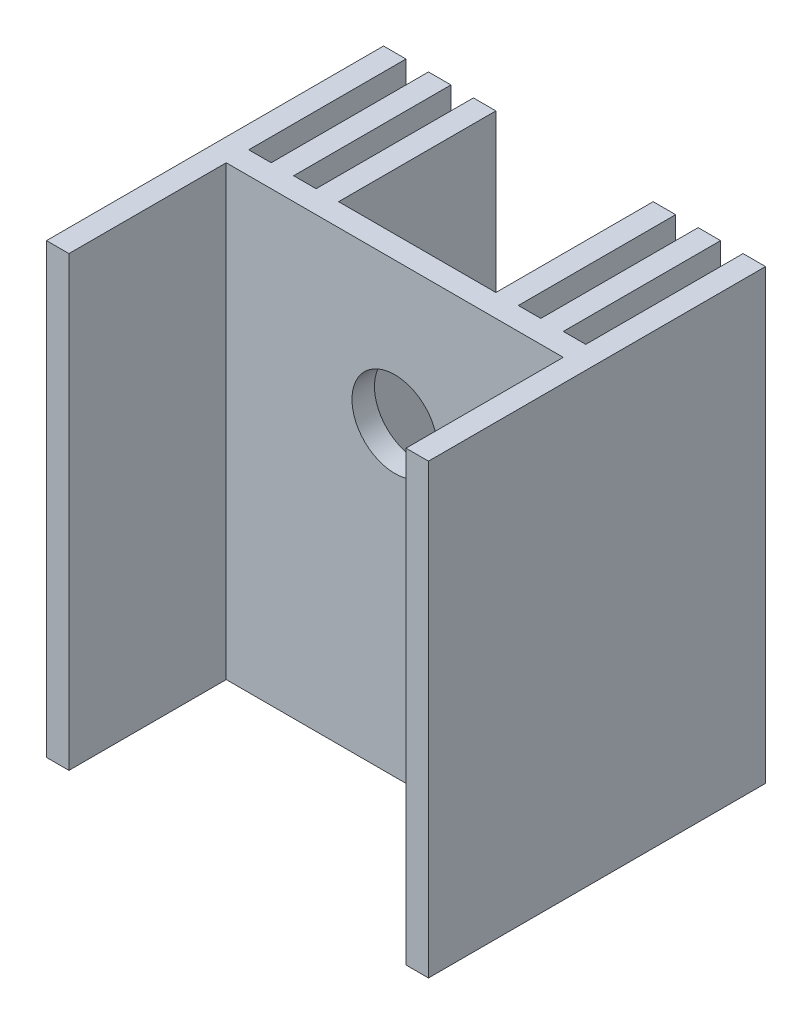
ISO-10303-21;
HEADER;
FILE_DESCRIPTION(('STEP AP214'),'2;1');
FILE_NAME('part.step','',(''),(''),'','','');
FILE_SCHEMA(('AUTOMOTIVE_DESIGN { 1 0 10303 214 1 1 1 1 }'));
ENDSEC;
DATA;
#1=APPLICATION_CONTEXT('core data for automotive mechanical design processes');
#2=APPLICATION_PROTOCOL_DEFINITION('international standard','automotive_design',2000,#1);
#3=PRODUCT_CONTEXT('',#1,'mechanical');
#4=PRODUCT('Part','Part','',(#3));
#5=PRODUCT_RELATED_PRODUCT_CATEGORY('part','',(#4));
#6=PRODUCT_DEFINITION_FORMATION('','',#4);
#7=PRODUCT_DEFINITION_CONTEXT('part definition',#1,'design');
#8=PRODUCT_DEFINITION('design','',#6,#7);
#9=PRODUCT_DEFINITION_SHAPE('','',#8);
#10=(LENGTH_UNIT() NAMED_UNIT(*) SI_UNIT(.MILLI.,.METRE.));
#11=(NAMED_UNIT(*) PLANE_ANGLE_UNIT() SI_UNIT($,.RADIAN.));
#12=(NAMED_UNIT(*) SI_UNIT($,.STERADIAN.) SOLID_ANGLE_UNIT());
#13=UNCERTAINTY_MEASURE_WITH_UNIT(LENGTH_MEASURE(1.E-05),#10,'distance_accuracy_value','');
#14=(GEOMETRIC_REPRESENTATION_CONTEXT(3) GLOBAL_UNCERTAINTY_ASSIGNED_CONTEXT((#13)) GLOBAL_UNIT_ASSIGNED_CONTEXT((#10,
#11,#12)) REPRESENTATION_CONTEXT('',''));
#15=CARTESIAN_POINT('',(0.,0.,0.));
#16=DIRECTION('',(0.,0.,1.));
#17=DIRECTION('',(1.,0.,0.));
#18=AXIS2_PLACEMENT_3D('',#15,#16,#17);
#19=CARTESIAN_POINT('',(0.,0.,-1.));
#20=DIRECTION('',(0.,0.,1.));
#21=DIRECTION('',(1.,0.,0.));
#22=AXIS2_PLACEMENT_3D('',#19,#20,#21);
#23=PLANE('',#22);
#24=DIRECTION('',(-1.,0.,0.));
#25=VECTOR('',#24,1.);
#26=CARTESIAN_POINT('',(8.5,-2.13178054260405,-1.));
#27=LINE('',#26,#25);
#28=CARTESIAN_POINT('',(5.5,-2.13178054260406,-1.));
#29=VERTEX_POINT('',#28);
#30=CARTESIAN_POINT('',(4.5,-2.13178054260406,-1.));
#31=VERTEX_POINT('',#30);
#32=EDGE_CURVE('E49',#29,#31,#27,.T.);
#33=ORIENTED_EDGE('',*,*,#32,.T.);
#34=DIRECTION('',(0.,-1.,0.));
#35=VECTOR('',#34,1.);
#36=CARTESIAN_POINT('',(4.5,17.7884630638602,-1.));
#37=LINE('',#36,#35);
#38=CARTESIAN_POINT('',(4.5,17.7884630638602,-1.));
#39=VERTEX_POINT('',#38);
#40=EDGE_CURVE('E385',#39,#31,#37,.T.);
#41=ORIENTED_EDGE('',*,*,#40,.F.);
#42=DIRECTION('',(1.,0.,0.));
#43=VECTOR('',#42,1.);
#44=CARTESIAN_POINT('',(8.5,17.7884630638602,-1.));
#45=LINE('',#44,#43);
#46=CARTESIAN_POINT('',(5.5,17.7884630638602,-1.));
#47=VERTEX_POINT('',#46);
#48=EDGE_CURVE('E56',#39,#47,#45,.T.);
#49=ORIENTED_EDGE('',*,*,#48,.T.);
#50=DIRECTION('',(0.,1.,0.));
#51=VECTOR('',#50,1.);
#52=CARTESIAN_POINT('',(5.5,17.7884630638602,-1.));
#53=LINE('',#52,#51);
#54=EDGE_CURVE('E420',#29,#47,#53,.T.);
#55=ORIENTED_EDGE('',*,*,#54,.F.);
#56=EDGE_LOOP('',(#33,#41,#49,#55));
#57=FACE_BOUND('',#56,.T.);
#58=ADVANCED_FACE('F34',(#57),#23,.F.);
#59=CARTESIAN_POINT('',(5.5,17.7884630638602,-8.));
#60=DIRECTION('',(1.,0.,0.));
#61=DIRECTION('',(0.,1.,0.));
#62=AXIS2_PLACEMENT_3D('',#59,#60,#61);
#63=PLANE('',#62);
#64=ORIENTED_EDGE('',*,*,#54,.T.);
#65=DIRECTION('',(0.,0.,1.));
#66=VECTOR('',#65,1.);
#67=CARTESIAN_POINT('',(5.5,17.7884630638602,-8.));
#68=LINE('',#67,#66);
#69=CARTESIAN_POINT('',(5.5,17.7884630638602,-8.));
#70=VERTEX_POINT('',#69);
#71=EDGE_CURVE('E42',#70,#47,#68,.T.);
#72=ORIENTED_EDGE('',*,*,#71,.F.);
#73=DIRECTION('',(0.,1.,0.));
#74=VECTOR('',#73,1.);
#75=CARTESIAN_POINT('',(5.5,17.7884630638602,-8.));
#76=LINE('',#75,#74);
#77=CARTESIAN_POINT('',(5.5,-2.13178054260406,-8.));
#78=VERTEX_POINT('',#77);
#79=EDGE_CURVE('E402',#78,#70,#76,.T.);
#80=ORIENTED_EDGE('',*,*,#79,.F.);
#81=DIRECTION('',(0.,0.,1.));
#82=VECTOR('',#81,1.);
#83=CARTESIAN_POINT('',(5.5,-2.13178054260406,-8.));
#84=LINE('',#83,#82);
#85=EDGE_CURVE('E11',#78,#29,#84,.T.);
#86=ORIENTED_EDGE('',*,*,#85,.T.);
#87=EDGE_LOOP('',(#64,#72,#80,#86));
#88=FACE_BOUND('',#87,.T.);
#89=ADVANCED_FACE('F36',(#88),#63,.F.);
#90=CARTESIAN_POINT('',(6.5,17.7884630638602,-8.));
#91=DIRECTION('',(-1.,0.,0.));
#92=DIRECTION('',(0.,-1.,0.));
#93=AXIS2_PLACEMENT_3D('',#90,#91,#92);
#94=PLANE('',#93);
#95=DIRECTION('',(0.,-1.,0.));
#96=VECTOR('',#95,1.);
#97=CARTESIAN_POINT('',(6.5,17.7884630638602,-1.));
#98=LINE('',#97,#96);
#99=CARTESIAN_POINT('',(6.5,17.7884630638602,-1.));
#100=VERTEX_POINT('',#99);
#101=CARTESIAN_POINT('',(6.5,-2.13178054260406,-1.));
#102=VERTEX_POINT('',#101);
#103=EDGE_CURVE('E411',#100,#102,#98,.T.);
#104=ORIENTED_EDGE('',*,*,#103,.T.);
#105=DIRECTION('',(0.,0.,1.));
#106=VECTOR('',#105,1.);
#107=CARTESIAN_POINT('',(6.5,-2.13178054260406,-8.));
#108=LINE('',#107,#106);
#109=CARTESIAN_POINT('',(6.5,-2.13178054260406,-8.));
#110=VERTEX_POINT('',#109);
#111=EDGE_CURVE('E414',#110,#102,#108,.T.);
#112=ORIENTED_EDGE('',*,*,#111,.F.);
#113=DIRECTION('',(0.,-1.,0.));
#114=VECTOR('',#113,1.);
#115=CARTESIAN_POINT('',(6.5,17.7884630638602,-8.));
#116=LINE('',#115,#114);
#117=CARTESIAN_POINT('',(6.5,17.7884630638602,-8.));
#118=VERTEX_POINT('',#117);
#119=EDGE_CURVE('E406',#118,#110,#116,.T.);
#120=ORIENTED_EDGE('',*,*,#119,.F.);
#121=DIRECTION('',(0.,0.,1.));
#122=VECTOR('',#121,1.);
#123=CARTESIAN_POINT('',(6.5,17.7884630638602,-8.));
#124=LINE('',#123,#122);
#125=EDGE_CURVE('E417',#118,#100,#124,.T.);
#126=ORIENTED_EDGE('',*,*,#125,.T.);
#127=EDGE_LOOP('',(#104,#112,#120,#126));
#128=FACE_BOUND('',#127,.T.);
#129=ADVANCED_FACE('F462',(#128),#94,.F.);
#130=CARTESIAN_POINT('',(12.,0.,-8.));
#131=DIRECTION('',(0.,0.,1.));
#132=DIRECTION('',(1.,0.,0.));
#133=AXIS2_PLACEMENT_3D('',#130,#131,#132);
#134=PLANE('',#133);
#135=ORIENTED_EDGE('',*,*,#79,.T.);
#136=DIRECTION('',(1.,0.,0.));
#137=VECTOR('',#136,1.);
#138=CARTESIAN_POINT('',(5.5,17.7884630638602,-8.));
#139=LINE('',#138,#137);
#140=EDGE_CURVE('E404',#70,#118,#139,.T.);
#141=ORIENTED_EDGE('',*,*,#140,.T.);
#142=ORIENTED_EDGE('',*,*,#119,.T.);
#143=DIRECTION('',(-1.,0.,0.));
#144=VECTOR('',#143,1.);
#145=CARTESIAN_POINT('',(5.5,-2.13178054260406,-8.));
#146=LINE('',#145,#144);
#147=EDGE_CURVE('E408',#110,#78,#146,.T.);
#148=ORIENTED_EDGE('',*,*,#147,.T.);
#149=EDGE_LOOP('',(#135,#141,#142,#148));
#150=FACE_BOUND('',#149,.T.);
#151=ADVANCED_FACE('F465',(#150),#134,.F.);
#152=CARTESIAN_POINT('',(0.,11.4682194573959,-1.));
#153=DIRECTION('',(0.,0.,1.));
#154=DIRECTION('',(1.,0.,0.));
#155=AXIS2_PLACEMENT_3D('',#152,#153,#154);
#156=CIRCLE('',#155,1.905);
#157=CARTESIAN_POINT('',(1.905,11.4682194573959,-1.));
#158=VERTEX_POINT('',#157);
#159=EDGE_CURVE('E494',#158,#158,#156,.F.);
#160=ORIENTED_EDGE('',*,*,#159,.F.);
#161=EDGE_LOOP('',(#160));
#162=FACE_BOUND('',#161,.T.);
#163=CARTESIAN_POINT('',(3.5,-2.13178054260406,-1.));
#164=VERTEX_POINT('',#163);
#165=CARTESIAN_POINT('',(-3.5,-2.13178054260406,-1.));
#166=VERTEX_POINT('',#165);
#167=EDGE_CURVE('E375',#164,#166,#27,.T.);
#168=ORIENTED_EDGE('',*,*,#167,.T.);
#169=DIRECTION('',(0.,-1.,0.));
#170=VECTOR('',#169,1.);
#171=CARTESIAN_POINT('',(-3.5,17.7884630638602,-1.));
#172=LINE('',#171,#170);
#173=CARTESIAN_POINT('',(-3.5,17.7884630638602,-1.));
#174=VERTEX_POINT('',#173);
#175=EDGE_CURVE('E357',#174,#166,#172,.T.);
#176=ORIENTED_EDGE('',*,*,#175,.F.);
#177=CARTESIAN_POINT('',(3.5,17.7884630638602,-1.));
#178=VERTEX_POINT('',#177);
#179=EDGE_CURVE('E350',#174,#178,#45,.T.);
#180=ORIENTED_EDGE('',*,*,#179,.T.);
#181=DIRECTION('',(0.,1.,0.));
#182=VECTOR('',#181,1.);
#183=CARTESIAN_POINT('',(3.5,17.7884630638602,-1.));
#184=LINE('',#183,#182);
#185=EDGE_CURVE('E393',#164,#178,#184,.T.);
#186=ORIENTED_EDGE('',*,*,#185,.F.);
#187=EDGE_LOOP('',(#168,#176,#180,#186));
#188=FACE_BOUND('',#187,.T.);
#189=ADVANCED_FACE('F443',(#162,#188),#23,.F.);
#190=CARTESIAN_POINT('',(3.5,17.7884630638602,-8.));
#191=DIRECTION('',(1.,0.,0.));
#192=DIRECTION('',(0.,1.,0.));
#193=AXIS2_PLACEMENT_3D('',#190,#191,#192);
#194=PLANE('',#193);
#195=ORIENTED_EDGE('',*,*,#185,.T.);
#196=DIRECTION('',(0.,0.,1.));
#197=VECTOR('',#196,1.);
#198=CARTESIAN_POINT('',(3.5,17.7884630638602,-8.));
#199=LINE('',#198,#197);
#200=CARTESIAN_POINT('',(3.5,17.7884630638602,-8.));
#201=VERTEX_POINT('',#200);
#202=EDGE_CURVE('E396',#201,#178,#199,.T.);
#203=ORIENTED_EDGE('',*,*,#202,.F.);
#204=DIRECTION('',(0.,1.,0.));
#205=VECTOR('',#204,1.);
#206=CARTESIAN_POINT('',(3.5,17.7884630638602,-8.));
#207=LINE('',#206,#205);
#208=CARTESIAN_POINT('',(3.5,-2.13178054260406,-8.));
#209=VERTEX_POINT('',#208);
#210=EDGE_CURVE('E376',#209,#201,#207,.T.);
#211=ORIENTED_EDGE('',*,*,#210,.F.);
#212=DIRECTION('',(0.,0.,1.));
#213=VECTOR('',#212,1.);
#214=CARTESIAN_POINT('',(3.5,-2.13178054260406,-8.));
#215=LINE('',#214,#213);
#216=EDGE_CURVE('E399',#209,#164,#215,.T.);
#217=ORIENTED_EDGE('',*,*,#216,.T.);
#218=EDGE_LOOP('',(#195,#203,#211,#217));
#219=FACE_BOUND('',#218,.T.);
#220=ADVANCED_FACE('F440',(#219),#194,.F.);
#221=CARTESIAN_POINT('',(4.5,17.7884630638602,-8.));
#222=DIRECTION('',(-1.,0.,0.));
#223=DIRECTION('',(0.,-1.,0.));
#224=AXIS2_PLACEMENT_3D('',#221,#222,#223);
#225=PLANE('',#224);
#226=ORIENTED_EDGE('',*,*,#40,.T.);
#227=DIRECTION('',(0.,0.,1.));
#228=VECTOR('',#227,1.);
#229=CARTESIAN_POINT('',(4.5,-2.13178054260406,-8.));
#230=LINE('',#229,#228);
#231=CARTESIAN_POINT('',(4.5,-2.13178054260406,-8.));
#232=VERTEX_POINT('',#231);
#233=EDGE_CURVE('E388',#232,#31,#230,.T.);
#234=ORIENTED_EDGE('',*,*,#233,.F.);
#235=DIRECTION('',(0.,-1.,0.));
#236=VECTOR('',#235,1.);
#237=CARTESIAN_POINT('',(4.5,17.7884630638602,-8.));
#238=LINE('',#237,#236);
#239=CARTESIAN_POINT('',(4.5,17.7884630638602,-8.));
#240=VERTEX_POINT('',#239);
#241=EDGE_CURVE('E380',#240,#232,#238,.T.);
#242=ORIENTED_EDGE('',*,*,#241,.F.);
#243=DIRECTION('',(0.,0.,1.));
#244=VECTOR('',#243,1.);
#245=CARTESIAN_POINT('',(4.5,17.7884630638602,-8.));
#246=LINE('',#245,#244);
#247=EDGE_CURVE('E390',#240,#39,#246,.T.);
#248=ORIENTED_EDGE('',*,*,#247,.T.);
#249=EDGE_LOOP('',(#226,#234,#242,#248));
#250=FACE_BOUND('',#249,.T.);
#251=ADVANCED_FACE('F429',(#250),#225,.F.);
#252=CARTESIAN_POINT('',(10.,0.,-8.));
#253=DIRECTION('',(0.,0.,1.));
#254=DIRECTION('',(1.,0.,0.));
#255=AXIS2_PLACEMENT_3D('',#252,#253,#254);
#256=PLANE('',#255);
#257=ORIENTED_EDGE('',*,*,#210,.T.);
#258=DIRECTION('',(1.,0.,0.));
#259=VECTOR('',#258,1.);
#260=CARTESIAN_POINT('',(3.5,17.7884630638602,-8.));
#261=LINE('',#260,#259);
#262=EDGE_CURVE('E378',#201,#240,#261,.T.);
#263=ORIENTED_EDGE('',*,*,#262,.T.);
#264=ORIENTED_EDGE('',*,*,#241,.T.);
#265=DIRECTION('',(-1.,0.,0.));
#266=VECTOR('',#265,1.);
#267=CARTESIAN_POINT('',(3.5,-2.13178054260406,-8.));
#268=LINE('',#267,#266);
#269=EDGE_CURVE('E382',#232,#209,#268,.T.);
#270=ORIENTED_EDGE('',*,*,#269,.T.);
#271=EDGE_LOOP('',(#257,#263,#264,#270));
#272=FACE_BOUND('',#271,.T.);
#273=ADVANCED_FACE('F436',(#272),#256,.F.);
#274=CARTESIAN_POINT('',(-4.5,-2.13178054260405,-1.));
#275=VERTEX_POINT('',#274);
#276=CARTESIAN_POINT('',(-5.5,-2.13178054260405,-1.));
#277=VERTEX_POINT('',#276);
#278=EDGE_CURVE('E346',#275,#277,#27,.T.);
#279=ORIENTED_EDGE('',*,*,#278,.T.);
#280=DIRECTION('',(0.,-1.,0.));
#281=VECTOR('',#280,1.);
#282=CARTESIAN_POINT('',(-5.5,17.7884630638602,-1.));
#283=LINE('',#282,#281);
#284=CARTESIAN_POINT('',(-5.5,17.7884630638602,-1.));
#285=VERTEX_POINT('',#284);
#286=EDGE_CURVE('E242',#285,#277,#283,.T.);
#287=ORIENTED_EDGE('',*,*,#286,.F.);
#288=CARTESIAN_POINT('',(-4.5,17.7884630638602,-1.));
#289=VERTEX_POINT('',#288);
#290=EDGE_CURVE('E327',#285,#289,#45,.T.);
#291=ORIENTED_EDGE('',*,*,#290,.T.);
#292=DIRECTION('',(0.,1.,0.));
#293=VECTOR('',#292,1.);
#294=CARTESIAN_POINT('',(-4.5,17.7884630638602,-1.));
#295=LINE('',#294,#293);
#296=EDGE_CURVE('E366',#275,#289,#295,.T.);
#297=ORIENTED_EDGE('',*,*,#296,.F.);
#298=EDGE_LOOP('',(#279,#287,#291,#297));
#299=FACE_BOUND('',#298,.T.);
#300=ADVANCED_FACE('F474',(#299),#23,.F.);
#301=CARTESIAN_POINT('',(-4.5,17.7884630638602,-8.));
#302=DIRECTION('',(1.,0.,0.));
#303=DIRECTION('',(0.,1.,0.));
#304=AXIS2_PLACEMENT_3D('',#301,#302,#303);
#305=PLANE('',#304);
#306=ORIENTED_EDGE('',*,*,#296,.T.);
#307=DIRECTION('',(0.,0.,1.));
#308=VECTOR('',#307,1.);
#309=CARTESIAN_POINT('',(-4.5,17.7884630638602,-8.));
#310=LINE('',#309,#308);
#311=CARTESIAN_POINT('',(-4.5,17.7884630638602,-8.));
#312=VERTEX_POINT('',#311);
#313=EDGE_CURVE('E369',#312,#289,#310,.T.);
#314=ORIENTED_EDGE('',*,*,#313,.F.);
#315=DIRECTION('',(0.,1.,0.));
#316=VECTOR('',#315,1.);
#317=CARTESIAN_POINT('',(-4.5,17.7884630638602,-8.));
#318=LINE('',#317,#316);
#319=CARTESIAN_POINT('',(-4.5,-2.13178054260405,-8.));
#320=VERTEX_POINT('',#319);
#321=EDGE_CURVE('E347',#320,#312,#318,.T.);
#322=ORIENTED_EDGE('',*,*,#321,.F.);
#323=DIRECTION('',(0.,0.,1.));
#324=VECTOR('',#323,1.);
#325=CARTESIAN_POINT('',(-4.5,-2.13178054260405,-8.));
#326=LINE('',#325,#324);
#327=EDGE_CURVE('E372',#320,#275,#326,.T.);
#328=ORIENTED_EDGE('',*,*,#327,.T.);
#329=EDGE_LOOP('',(#306,#314,#322,#328));
#330=FACE_BOUND('',#329,.T.);
#331=ADVANCED_FACE('F566',(#330),#305,.F.);
#332=CARTESIAN_POINT('',(-3.5,17.7884630638602,-8.));
#333=DIRECTION('',(-1.,0.,0.));
#334=DIRECTION('',(0.,-1.,0.));
#335=AXIS2_PLACEMENT_3D('',#332,#333,#334);
#336=PLANE('',#335);
#337=ORIENTED_EDGE('',*,*,#175,.T.);
#338=DIRECTION('',(0.,0.,1.));
#339=VECTOR('',#338,1.);
#340=CARTESIAN_POINT('',(-3.5,-2.13178054260405,-8.));
#341=LINE('',#340,#339);
#342=CARTESIAN_POINT('',(-3.5,-2.13178054260405,-8.));
#343=VERTEX_POINT('',#342);
#344=EDGE_CURVE('E360',#343,#166,#341,.T.);
#345=ORIENTED_EDGE('',*,*,#344,.F.);
#346=DIRECTION('',(0.,-1.,0.));
#347=VECTOR('',#346,1.);
#348=CARTESIAN_POINT('',(-3.5,17.7884630638602,-8.));
#349=LINE('',#348,#347);
#350=CARTESIAN_POINT('',(-3.5,17.7884630638602,-8.));
#351=VERTEX_POINT('',#350);
#352=EDGE_CURVE('E352',#351,#343,#349,.T.);
#353=ORIENTED_EDGE('',*,*,#352,.F.);
#354=DIRECTION('',(0.,0.,1.));
#355=VECTOR('',#354,1.);
#356=CARTESIAN_POINT('',(-3.5,17.7884630638602,-8.));
#357=LINE('',#356,#355);
#358=EDGE_CURVE('E363',#351,#174,#357,.T.);
#359=ORIENTED_EDGE('',*,*,#358,.T.);
#360=EDGE_LOOP('',(#337,#345,#353,#359));
#361=FACE_BOUND('',#360,.T.);
#362=ADVANCED_FACE('F491',(#361),#336,.F.);
#363=CARTESIAN_POINT('',(2.,0.,-8.));
#364=DIRECTION('',(0.,0.,1.));
#365=DIRECTION('',(1.,0.,0.));
#366=AXIS2_PLACEMENT_3D('',#363,#364,#365);
#367=PLANE('',#366);
#368=ORIENTED_EDGE('',*,*,#321,.T.);
#369=DIRECTION('',(1.,0.,0.));
#370=VECTOR('',#369,1.);
#371=CARTESIAN_POINT('',(-4.5,17.7884630638602,-8.));
#372=LINE('',#371,#370);
#373=EDGE_CURVE('E349',#312,#351,#372,.T.);
#374=ORIENTED_EDGE('',*,*,#373,.T.);
#375=ORIENTED_EDGE('',*,*,#352,.T.);
#376=DIRECTION('',(-1.,0.,0.));
#377=VECTOR('',#376,1.);
#378=CARTESIAN_POINT('',(-4.5,-2.13178054260405,-8.));
#379=LINE('',#378,#377);
#380=EDGE_CURVE('E354',#343,#320,#379,.T.);
#381=ORIENTED_EDGE('',*,*,#380,.T.);
#382=EDGE_LOOP('',(#368,#374,#375,#381));
#383=FACE_BOUND('',#382,.T.);
#384=ADVANCED_FACE('F484',(#383),#367,.F.);
#385=DIRECTION('',(0.,1.,0.));
#386=VECTOR('',#385,1.);
#387=CARTESIAN_POINT('',(-6.5,17.7884630638602,-1.));
#388=LINE('',#387,#386);
#389=CARTESIAN_POINT('',(-6.5,-2.13178054260405,-1.));
#390=VERTEX_POINT('',#389);
#391=CARTESIAN_POINT('',(-6.5,17.7884630638602,-1.));
#392=VERTEX_POINT('',#391);
#393=EDGE_CURVE('E246',#390,#392,#388,.T.);
#394=ORIENTED_EDGE('',*,*,#393,.F.);
#395=CARTESIAN_POINT('',(-7.5,-2.13178054260405,-1.));
#396=VERTEX_POINT('',#395);
#397=EDGE_CURVE('E326',#390,#396,#27,.T.);
#398=ORIENTED_EDGE('',*,*,#397,.T.);
#399=DIRECTION('',(0.,-1.,0.));
#400=VECTOR('',#399,1.);
#401=CARTESIAN_POINT('',(-7.5,0.,-1.));
#402=LINE('',#401,#400);
#403=CARTESIAN_POINT('',(-7.5,17.7884630638602,-1.));
#404=VERTEX_POINT('',#403);
#405=EDGE_CURVE('E312',#404,#396,#402,.T.);
#406=ORIENTED_EDGE('',*,*,#405,.F.);
#407=EDGE_CURVE('E324',#404,#392,#45,.T.);
#408=ORIENTED_EDGE('',*,*,#407,.T.);
#409=EDGE_LOOP('',(#394,#398,#406,#408));
#410=FACE_BOUND('',#409,.T.);
#411=ADVANCED_FACE('F477',(#410),#23,.F.);
#412=CARTESIAN_POINT('',(7.5,-2.13178054260405,-1.));
#413=VERTEX_POINT('',#412);
#414=EDGE_CURVE('E329',#413,#102,#27,.T.);
#415=ORIENTED_EDGE('',*,*,#414,.T.);
#416=ORIENTED_EDGE('',*,*,#103,.F.);
#417=CARTESIAN_POINT('',(7.5,17.7884630638602,-1.));
#418=VERTEX_POINT('',#417);
#419=EDGE_CURVE('E328',#100,#418,#45,.T.);
#420=ORIENTED_EDGE('',*,*,#419,.T.);
#421=DIRECTION('',(0.,1.,0.));
#422=VECTOR('',#421,1.);
#423=CARTESIAN_POINT('',(7.5,0.,-1.));
#424=LINE('',#423,#422);
#425=EDGE_CURVE('E285',#413,#418,#424,.T.);
#426=ORIENTED_EDGE('',*,*,#425,.F.);
#427=EDGE_LOOP('',(#415,#416,#420,#426));
#428=FACE_BOUND('',#427,.T.);
#429=ADVANCED_FACE('F448',(#428),#23,.F.);
#430=CARTESIAN_POINT('',(0.,0.,0.));
#431=DIRECTION('',(0.,0.,1.));
#432=DIRECTION('',(1.,0.,0.));
#433=AXIS2_PLACEMENT_3D('',#430,#431,#432);
#434=PLANE('',#433);
#435=CARTESIAN_POINT('',(0.,11.4682194573959,0.));
#436=DIRECTION('',(0.,0.,1.));
#437=DIRECTION('',(1.,0.,0.));
#438=AXIS2_PLACEMENT_3D('',#435,#436,#437);
#439=CIRCLE('',#438,1.905);
#440=CARTESIAN_POINT('',(1.905,11.4682194573959,0.));
#441=VERTEX_POINT('',#440);
#442=EDGE_CURVE('E506',#441,#441,#439,.T.);
#443=ORIENTED_EDGE('',*,*,#442,.F.);
#444=EDGE_LOOP('',(#443));
#445=FACE_BOUND('',#444,.T.);
#446=DIRECTION('',(-1.,0.,0.));
#447=VECTOR('',#446,1.);
#448=CARTESIAN_POINT('',(8.5,-2.13178054260405,0.));
#449=LINE('',#448,#447);
#450=CARTESIAN_POINT('',(7.5,-2.13178054260405,0.));
#451=VERTEX_POINT('',#450);
#452=CARTESIAN_POINT('',(-7.5,-2.13178054260405,0.));
#453=VERTEX_POINT('',#452);
#454=EDGE_CURVE('E334',#451,#453,#449,.T.);
#455=ORIENTED_EDGE('',*,*,#454,.F.);
#456=DIRECTION('',(0.,1.,0.));
#457=VECTOR('',#456,1.);
#458=CARTESIAN_POINT('',(7.5,0.,0.));
#459=LINE('',#458,#457);
#460=CARTESIAN_POINT('',(7.5,17.7884630638602,0.));
#461=VERTEX_POINT('',#460);
#462=EDGE_CURVE('E274',#451,#461,#459,.T.);
#463=ORIENTED_EDGE('',*,*,#462,.T.);
#464=DIRECTION('',(1.,0.,0.));
#465=VECTOR('',#464,1.);
#466=CARTESIAN_POINT('',(8.5,17.7884630638602,0.));
#467=LINE('',#466,#465);
#468=CARTESIAN_POINT('',(-7.5,17.7884630638602,0.));
#469=VERTEX_POINT('',#468);
#470=EDGE_CURVE('E323',#469,#461,#467,.T.);
#471=ORIENTED_EDGE('',*,*,#470,.F.);
#472=DIRECTION('',(0.,-1.,0.));
#473=VECTOR('',#472,1.);
#474=CARTESIAN_POINT('',(-7.5,0.,0.));
#475=LINE('',#474,#473);
#476=EDGE_CURVE('E343',#469,#453,#475,.T.);
#477=ORIENTED_EDGE('',*,*,#476,.T.);
#478=EDGE_LOOP('',(#455,#463,#471,#477));
#479=FACE_BOUND('',#478,.T.);
#480=ADVANCED_FACE('F490',(#445,#479),#434,.T.);
#481=CARTESIAN_POINT('',(8.5,17.7884630638602,-1.));
#482=DIRECTION('',(0.,-1.,0.));
#483=DIRECTION('',(1.,0.,0.));
#484=AXIS2_PLACEMENT_3D('',#481,#482,#483);
#485=PLANE('',#484);
#486=ORIENTED_EDGE('',*,*,#48,.F.);
#487=ORIENTED_EDGE('',*,*,#247,.F.);
#488=ORIENTED_EDGE('',*,*,#262,.F.);
#489=ORIENTED_EDGE('',*,*,#202,.T.);
#490=ORIENTED_EDGE('',*,*,#179,.F.);
#491=ORIENTED_EDGE('',*,*,#358,.F.);
#492=ORIENTED_EDGE('',*,*,#373,.F.);
#493=ORIENTED_EDGE('',*,*,#313,.T.);
#494=ORIENTED_EDGE('',*,*,#290,.F.);
#495=DIRECTION('',(0.,0.,1.));
#496=VECTOR('',#495,1.);
#497=CARTESIAN_POINT('',(-5.5,17.7884630638602,-8.));
#498=LINE('',#497,#496);
#499=CARTESIAN_POINT('',(-5.5,17.7884630638602,-8.));
#500=VERTEX_POINT('',#499);
#501=EDGE_CURVE('E229',#500,#285,#498,.T.);
#502=ORIENTED_EDGE('',*,*,#501,.F.);
#503=DIRECTION('',(1.,0.,0.));
#504=VECTOR('',#503,1.);
#505=CARTESIAN_POINT('',(-6.5,17.7884630638602,-8.));
#506=LINE('',#505,#504);
#507=CARTESIAN_POINT('',(-6.5,17.7884630638602,-8.));
#508=VERTEX_POINT('',#507);
#509=EDGE_CURVE('E220',#508,#500,#506,.T.);
#510=ORIENTED_EDGE('',*,*,#509,.F.);
#511=DIRECTION('',(0.,0.,1.));
#512=VECTOR('',#511,1.);
#513=CARTESIAN_POINT('',(-6.5,17.7884630638602,-8.));
#514=LINE('',#513,#512);
#515=EDGE_CURVE('E225',#508,#392,#514,.T.);
#516=ORIENTED_EDGE('',*,*,#515,.T.);
#517=ORIENTED_EDGE('',*,*,#407,.F.);
#518=DIRECTION('',(0.,0.,-1.));
#519=VECTOR('',#518,1.);
#520=CARTESIAN_POINT('',(-7.5,17.7884630638602,-8.));
#521=LINE('',#520,#519);
#522=CARTESIAN_POINT('',(-7.5,17.7884630638602,-8.));
#523=VERTEX_POINT('',#522);
#524=EDGE_CURVE('E300',#404,#523,#521,.T.);
#525=ORIENTED_EDGE('',*,*,#524,.T.);
#526=DIRECTION('',(-1.,0.,0.));
#527=VECTOR('',#526,1.);
#528=CARTESIAN_POINT('',(-7.5,17.7884630638602,-8.));
#529=LINE('',#528,#527);
#530=CARTESIAN_POINT('',(-8.5,17.7884630638602,-8.));
#531=VERTEX_POINT('',#530);
#532=EDGE_CURVE('E309',#523,#531,#529,.T.);
#533=ORIENTED_EDGE('',*,*,#532,.T.);
#534=DIRECTION('',(0.,0.,1.));
#535=VECTOR('',#534,1.);
#536=CARTESIAN_POINT('',(-8.5,17.7884630638602,-1.));
#537=LINE('',#536,#535);
#538=CARTESIAN_POINT('',(-8.5,17.7884630638602,7.));
#539=VERTEX_POINT('',#538);
#540=EDGE_CURVE('E331',#531,#539,#537,.T.);
#541=ORIENTED_EDGE('',*,*,#540,.T.);
#542=DIRECTION('',(-1.,0.,0.));
#543=VECTOR('',#542,1.);
#544=CARTESIAN_POINT('',(-7.5,17.7884630638602,7.));
#545=LINE('',#544,#543);
#546=CARTESIAN_POINT('',(-7.5,17.7884630638602,7.));
#547=VERTEX_POINT('',#546);
#548=EDGE_CURVE('E313',#547,#539,#545,.T.);
#549=ORIENTED_EDGE('',*,*,#548,.F.);
#550=EDGE_CURVE('E301',#547,#469,#521,.T.);
#551=ORIENTED_EDGE('',*,*,#550,.T.);
#552=ORIENTED_EDGE('',*,*,#470,.T.);
#553=DIRECTION('',(0.,0.,-1.));
#554=VECTOR('',#553,1.);
#555=CARTESIAN_POINT('',(7.5,17.7884630638602,-8.));
#556=LINE('',#555,#554);
#557=CARTESIAN_POINT('',(7.5,17.7884630638602,7.));
#558=VERTEX_POINT('',#557);
#559=EDGE_CURVE('E260',#558,#461,#556,.T.);
#560=ORIENTED_EDGE('',*,*,#559,.F.);
#561=DIRECTION('',(1.,0.,0.));
#562=VECTOR('',#561,1.);
#563=CARTESIAN_POINT('',(7.5,17.7884630638602,7.));
#564=LINE('',#563,#562);
#565=CARTESIAN_POINT('',(8.5,17.7884630638602,7.));
#566=VERTEX_POINT('',#565);
#567=EDGE_CURVE('E278',#558,#566,#564,.T.);
#568=ORIENTED_EDGE('',*,*,#567,.T.);
#569=DIRECTION('',(0.,0.,1.));
#570=VECTOR('',#569,1.);
#571=CARTESIAN_POINT('',(8.5,17.7884630638602,-1.));
#572=LINE('',#571,#570);
#573=CARTESIAN_POINT('',(8.5,17.7884630638602,-8.));
#574=VERTEX_POINT('',#573);
#575=EDGE_CURVE('E341',#574,#566,#572,.T.);
#576=ORIENTED_EDGE('',*,*,#575,.F.);
#577=DIRECTION('',(1.,0.,0.));
#578=VECTOR('',#577,1.);
#579=CARTESIAN_POINT('',(7.5,17.7884630638602,-8.));
#580=LINE('',#579,#578);
#581=CARTESIAN_POINT('',(7.5,17.7884630638602,-8.));
#582=VERTEX_POINT('',#581);
#583=EDGE_CURVE('E267',#582,#574,#580,.T.);
#584=ORIENTED_EDGE('',*,*,#583,.F.);
#585=EDGE_CURVE('E259',#418,#582,#556,.T.);
#586=ORIENTED_EDGE('',*,*,#585,.F.);
#587=ORIENTED_EDGE('',*,*,#419,.F.);
#588=ORIENTED_EDGE('',*,*,#125,.F.);
#589=ORIENTED_EDGE('',*,*,#140,.F.);
#590=ORIENTED_EDGE('',*,*,#71,.T.);
#591=EDGE_LOOP('',(#486,#487,#488,#489,#490,#491,#492,#493,#494,#502,#510,#516,#517,#525,#533,
#541,#549,#551,#552,#560,#568,#576,#584,#586,#587,#588,#589,#590));
#592=FACE_BOUND('',#591,.T.);
#593=ADVANCED_FACE('F222',(#592),#485,.F.);
#594=CARTESIAN_POINT('',(8.5,17.7884630638602,-1.));
#595=DIRECTION('',(-1.,0.,0.));
#596=DIRECTION('',(0.,0.,1.));
#597=AXIS2_PLACEMENT_3D('',#594,#595,#596);
#598=PLANE('',#597);
#599=ORIENTED_EDGE('',*,*,#575,.T.);
#600=DIRECTION('',(0.,1.,0.));
#601=VECTOR('',#600,1.);
#602=CARTESIAN_POINT('',(8.5,17.7884630638602,7.));
#603=LINE('',#602,#601);
#604=CARTESIAN_POINT('',(8.5,-2.13178054260405,7.));
#605=VERTEX_POINT('',#604);
#606=EDGE_CURVE('E250',#605,#566,#603,.T.);
#607=ORIENTED_EDGE('',*,*,#606,.F.);
#608=DIRECTION('',(0.,0.,1.));
#609=VECTOR('',#608,1.);
#610=CARTESIAN_POINT('',(8.5,-2.13178054260405,-1.));
#611=LINE('',#610,#609);
#612=CARTESIAN_POINT('',(8.5,-2.13178054260406,-8.));
#613=VERTEX_POINT('',#612);
#614=EDGE_CURVE('E339',#613,#605,#611,.T.);
#615=ORIENTED_EDGE('',*,*,#614,.F.);
#616=DIRECTION('',(0.,-1.,0.));
#617=VECTOR('',#616,1.);
#618=CARTESIAN_POINT('',(8.5,17.7884630638602,-8.));
#619=LINE('',#618,#617);
#620=EDGE_CURVE('E247',#574,#613,#619,.T.);
#621=ORIENTED_EDGE('',*,*,#620,.F.);
#622=EDGE_LOOP('',(#599,#607,#615,#621));
#623=FACE_BOUND('',#622,.T.);
#624=ADVANCED_FACE('F556',(#623),#598,.F.);
#625=CARTESIAN_POINT('',(8.5,-2.13178054260405,-1.));
#626=DIRECTION('',(0.,1.,0.));
#627=DIRECTION('',(-1.,0.,0.));
#628=AXIS2_PLACEMENT_3D('',#625,#626,#627);
#629=PLANE('',#628);
#630=ORIENTED_EDGE('',*,*,#414,.F.);
#631=DIRECTION('',(0.,0.,1.));
#632=VECTOR('',#631,1.);
#633=CARTESIAN_POINT('',(7.5,-2.13178054260406,-8.));
#634=LINE('',#633,#632);
#635=CARTESIAN_POINT('',(7.5,-2.13178054260406,-8.));
#636=VERTEX_POINT('',#635);
#637=EDGE_CURVE('E265',#636,#413,#634,.T.);
#638=ORIENTED_EDGE('',*,*,#637,.F.);
#639=DIRECTION('',(1.,0.,0.));
#640=VECTOR('',#639,1.);
#641=CARTESIAN_POINT('',(7.5,-2.13178054260406,-8.));
#642=LINE('',#641,#640);
#643=EDGE_CURVE('E271',#636,#613,#642,.T.);
#644=ORIENTED_EDGE('',*,*,#643,.T.);
#645=ORIENTED_EDGE('',*,*,#614,.T.);
#646=DIRECTION('',(1.,0.,0.));
#647=VECTOR('',#646,1.);
#648=CARTESIAN_POINT('',(7.5,-2.13178054260405,7.));
#649=LINE('',#648,#647);
#650=CARTESIAN_POINT('',(7.5,-2.13178054260405,7.));
#651=VERTEX_POINT('',#650);
#652=EDGE_CURVE('E275',#651,#605,#649,.T.);
#653=ORIENTED_EDGE('',*,*,#652,.F.);
#654=EDGE_CURVE('E264',#451,#651,#634,.T.);
#655=ORIENTED_EDGE('',*,*,#654,.F.);
#656=ORIENTED_EDGE('',*,*,#454,.T.);
#657=DIRECTION('',(0.,0.,1.));
#658=VECTOR('',#657,1.);
#659=CARTESIAN_POINT('',(-7.5,-2.13178054260406,-8.));
#660=LINE('',#659,#658);
#661=CARTESIAN_POINT('',(-7.5,-2.13178054260405,7.));
#662=VERTEX_POINT('',#661);
#663=EDGE_CURVE('E292',#453,#662,#660,.T.);
#664=ORIENTED_EDGE('',*,*,#663,.T.);
#665=DIRECTION('',(-1.,0.,0.));
#666=VECTOR('',#665,1.);
#667=CARTESIAN_POINT('',(-7.5,-2.13178054260405,7.));
#668=LINE('',#667,#666);
#669=CARTESIAN_POINT('',(-8.5,-2.13178054260405,7.));
#670=VERTEX_POINT('',#669);
#671=EDGE_CURVE('E316',#662,#670,#668,.T.);
#672=ORIENTED_EDGE('',*,*,#671,.T.);
#673=DIRECTION('',(0.,0.,1.));
#674=VECTOR('',#673,1.);
#675=CARTESIAN_POINT('',(-8.5,-2.13178054260405,-1.));
#676=LINE('',#675,#674);
#677=CARTESIAN_POINT('',(-8.5,-2.13178054260406,-8.));
#678=VERTEX_POINT('',#677);
#679=EDGE_CURVE('E337',#678,#670,#676,.T.);
#680=ORIENTED_EDGE('',*,*,#679,.F.);
#681=DIRECTION('',(-1.,0.,0.));
#682=VECTOR('',#681,1.);
#683=CARTESIAN_POINT('',(-7.5,-2.13178054260406,-8.));
#684=LINE('',#683,#682);
#685=CARTESIAN_POINT('',(-7.5,-2.13178054260406,-8.));
#686=VERTEX_POINT('',#685);
#687=EDGE_CURVE('E304',#686,#678,#684,.T.);
#688=ORIENTED_EDGE('',*,*,#687,.F.);
#689=EDGE_CURVE('E294',#686,#396,#660,.T.);
#690=ORIENTED_EDGE('',*,*,#689,.T.);
#691=ORIENTED_EDGE('',*,*,#397,.F.);
#692=DIRECTION('',(0.,0.,1.));
#693=VECTOR('',#692,1.);
#694=CARTESIAN_POINT('',(-6.5,-2.13178054260405,-8.));
#695=LINE('',#694,#693);
#696=CARTESIAN_POINT('',(-6.5,-2.13178054260405,-8.));
#697=VERTEX_POINT('',#696);
#698=EDGE_CURVE('E496',#697,#390,#695,.T.);
#699=ORIENTED_EDGE('',*,*,#698,.F.);
#700=DIRECTION('',(-1.,0.,0.));
#701=VECTOR('',#700,1.);
#702=CARTESIAN_POINT('',(-6.5,-2.13178054260405,-8.));
#703=LINE('',#702,#701);
#704=CARTESIAN_POINT('',(-5.5,-2.13178054260405,-8.));
#705=VERTEX_POINT('',#704);
#706=EDGE_CURVE('E238',#705,#697,#703,.T.);
#707=ORIENTED_EDGE('',*,*,#706,.F.);
#708=DIRECTION('',(0.,0.,1.));
#709=VECTOR('',#708,1.);
#710=CARTESIAN_POINT('',(-5.5,-2.13178054260405,-8.));
#711=LINE('',#710,#709);
#712=EDGE_CURVE('E252',#705,#277,#711,.T.);
#713=ORIENTED_EDGE('',*,*,#712,.T.);
#714=ORIENTED_EDGE('',*,*,#278,.F.);
#715=ORIENTED_EDGE('',*,*,#327,.F.);
#716=ORIENTED_EDGE('',*,*,#380,.F.);
#717=ORIENTED_EDGE('',*,*,#344,.T.);
#718=ORIENTED_EDGE('',*,*,#167,.F.);
#719=ORIENTED_EDGE('',*,*,#216,.F.);
#720=ORIENTED_EDGE('',*,*,#269,.F.);
#721=ORIENTED_EDGE('',*,*,#233,.T.);
#722=ORIENTED_EDGE('',*,*,#32,.F.);
#723=ORIENTED_EDGE('',*,*,#85,.F.);
#724=ORIENTED_EDGE('',*,*,#147,.F.);
#725=ORIENTED_EDGE('',*,*,#111,.T.);
#726=EDGE_LOOP('',(#630,#638,#644,#645,#653,#655,#656,#664,#672,#680,#688,#690,#691,#699,#707,
#713,#714,#715,#716,#717,#718,#719,#720,#721,#722,#723,#724,#725));
#727=FACE_BOUND('',#726,.T.);
#728=ADVANCED_FACE('F433',(#727),#629,.F.);
#729=CARTESIAN_POINT('',(-8.5,17.7884630638602,-1.));
#730=DIRECTION('',(1.,0.,0.));
#731=DIRECTION('',(0.,0.,-1.));
#732=AXIS2_PLACEMENT_3D('',#729,#730,#731);
#733=PLANE('',#732);
#734=ORIENTED_EDGE('',*,*,#679,.T.);
#735=DIRECTION('',(0.,1.,0.));
#736=VECTOR('',#735,1.);
#737=CARTESIAN_POINT('',(-8.5,17.7884630638602,7.));
#738=LINE('',#737,#736);
#739=EDGE_CURVE('E293',#670,#539,#738,.T.);
#740=ORIENTED_EDGE('',*,*,#739,.T.);
#741=ORIENTED_EDGE('',*,*,#540,.F.);
#742=DIRECTION('',(0.,-1.,0.));
#743=VECTOR('',#742,1.);
#744=CARTESIAN_POINT('',(-8.5,17.7884630638602,-8.));
#745=LINE('',#744,#743);
#746=EDGE_CURVE('E288',#531,#678,#745,.T.);
#747=ORIENTED_EDGE('',*,*,#746,.T.);
#748=EDGE_LOOP('',(#734,#740,#741,#747));
#749=FACE_BOUND('',#748,.T.);
#750=ADVANCED_FACE('F534',(#749),#733,.F.);
#751=CARTESIAN_POINT('',(-7.5,17.7884630638602,7.));
#752=DIRECTION('',(0.,0.,1.));
#753=DIRECTION('',(0.,-1.,0.));
#754=AXIS2_PLACEMENT_3D('',#751,#752,#753);
#755=PLANE('',#754);
#756=ORIENTED_EDGE('',*,*,#739,.F.);
#757=ORIENTED_EDGE('',*,*,#671,.F.);
#758=DIRECTION('',(0.,1.,0.));
#759=VECTOR('',#758,1.);
#760=CARTESIAN_POINT('',(-7.5,17.7884630638602,7.));
#761=LINE('',#760,#759);
#762=EDGE_CURVE('E297',#662,#547,#761,.T.);
#763=ORIENTED_EDGE('',*,*,#762,.T.);
#764=ORIENTED_EDGE('',*,*,#548,.T.);
#765=EDGE_LOOP('',(#756,#757,#763,#764));
#766=FACE_BOUND('',#765,.T.);
#767=ADVANCED_FACE('F526',(#766),#755,.T.);
#768=CARTESIAN_POINT('',(-7.5,0.,0.));
#769=DIRECTION('',(-1.,0.,0.));
#770=DIRECTION('',(0.,0.,1.));
#771=AXIS2_PLACEMENT_3D('',#768,#769,#770);
#772=PLANE('',#771);
#773=ORIENTED_EDGE('',*,*,#476,.F.);
#774=ORIENTED_EDGE('',*,*,#550,.F.);
#775=ORIENTED_EDGE('',*,*,#762,.F.);
#776=ORIENTED_EDGE('',*,*,#663,.F.);
#777=EDGE_LOOP('',(#773,#774,#775,#776));
#778=FACE_BOUND('',#777,.T.);
#779=ADVANCED_FACE('F522',(#778),#772,.F.);
#780=ORIENTED_EDGE('',*,*,#524,.F.);
#781=ORIENTED_EDGE('',*,*,#405,.T.);
#782=ORIENTED_EDGE('',*,*,#689,.F.);
#783=DIRECTION('',(0.,-1.,0.));
#784=VECTOR('',#783,1.);
#785=CARTESIAN_POINT('',(-7.5,17.7884630638602,-8.));
#786=LINE('',#785,#784);
#787=EDGE_CURVE('E289',#523,#686,#786,.T.);
#788=ORIENTED_EDGE('',*,*,#787,.F.);
#789=EDGE_LOOP('',(#780,#781,#782,#788));
#790=FACE_BOUND('',#789,.T.);
#791=ADVANCED_FACE('F537',(#790),#772,.F.);
#792=CARTESIAN_POINT('',(-7.5,17.7884630638602,-8.));
#793=DIRECTION('',(0.,0.,-1.));
#794=DIRECTION('',(0.,1.,0.));
#795=AXIS2_PLACEMENT_3D('',#792,#793,#794);
#796=PLANE('',#795);
#797=ORIENTED_EDGE('',*,*,#746,.F.);
#798=ORIENTED_EDGE('',*,*,#532,.F.);
#799=ORIENTED_EDGE('',*,*,#787,.T.);
#800=ORIENTED_EDGE('',*,*,#687,.T.);
#801=EDGE_LOOP('',(#797,#798,#799,#800));
#802=FACE_BOUND('',#801,.T.);
#803=ADVANCED_FACE('F531',(#802),#796,.T.);
#804=CARTESIAN_POINT('',(7.5,17.7884630638602,7.));
#805=DIRECTION('',(0.,0.,-1.));
#806=DIRECTION('',(0.,1.,0.));
#807=AXIS2_PLACEMENT_3D('',#804,#805,#806);
#808=PLANE('',#807);
#809=ORIENTED_EDGE('',*,*,#606,.T.);
#810=ORIENTED_EDGE('',*,*,#567,.F.);
#811=DIRECTION('',(0.,1.,0.));
#812=VECTOR('',#811,1.);
#813=CARTESIAN_POINT('',(7.5,17.7884630638602,7.));
#814=LINE('',#813,#812);
#815=EDGE_CURVE('E262',#651,#558,#814,.T.);
#816=ORIENTED_EDGE('',*,*,#815,.F.);
#817=ORIENTED_EDGE('',*,*,#652,.T.);
#818=EDGE_LOOP('',(#809,#810,#816,#817));
#819=FACE_BOUND('',#818,.T.);
#820=ADVANCED_FACE('F544',(#819),#808,.F.);
#821=CARTESIAN_POINT('',(7.5,0.,0.));
#822=DIRECTION('',(1.,0.,0.));
#823=DIRECTION('',(0.,0.,1.));
#824=AXIS2_PLACEMENT_3D('',#821,#822,#823);
#825=PLANE('',#824);
#826=ORIENTED_EDGE('',*,*,#462,.F.);
#827=ORIENTED_EDGE('',*,*,#654,.T.);
#828=ORIENTED_EDGE('',*,*,#815,.T.);
#829=ORIENTED_EDGE('',*,*,#559,.T.);
#830=EDGE_LOOP('',(#826,#827,#828,#829));
#831=FACE_BOUND('',#830,.T.);
#832=ADVANCED_FACE('F679',(#831),#825,.F.);
#833=ORIENTED_EDGE('',*,*,#637,.T.);
#834=ORIENTED_EDGE('',*,*,#425,.T.);
#835=ORIENTED_EDGE('',*,*,#585,.T.);
#836=DIRECTION('',(0.,-1.,0.));
#837=VECTOR('',#836,1.);
#838=CARTESIAN_POINT('',(7.5,17.7884630638602,-8.));
#839=LINE('',#838,#837);
#840=EDGE_CURVE('E256',#582,#636,#839,.T.);
#841=ORIENTED_EDGE('',*,*,#840,.T.);
#842=EDGE_LOOP('',(#833,#834,#835,#841));
#843=FACE_BOUND('',#842,.T.);
#844=ADVANCED_FACE('F451',(#843),#825,.F.);
#845=CARTESIAN_POINT('',(7.5,17.7884630638602,-8.));
#846=DIRECTION('',(0.,0.,1.));
#847=DIRECTION('',(0.,-1.,0.));
#848=AXIS2_PLACEMENT_3D('',#845,#846,#847);
#849=PLANE('',#848);
#850=ORIENTED_EDGE('',*,*,#620,.T.);
#851=ORIENTED_EDGE('',*,*,#643,.F.);
#852=ORIENTED_EDGE('',*,*,#840,.F.);
#853=ORIENTED_EDGE('',*,*,#583,.T.);
#854=EDGE_LOOP('',(#850,#851,#852,#853));
#855=FACE_BOUND('',#854,.T.);
#856=ADVANCED_FACE('F457',(#855),#849,.F.);
#857=CARTESIAN_POINT('',(-6.5,17.7884630638602,-8.));
#858=DIRECTION('',(1.,0.,0.));
#859=DIRECTION('',(0.,1.,0.));
#860=AXIS2_PLACEMENT_3D('',#857,#858,#859);
#861=PLANE('',#860);
#862=ORIENTED_EDGE('',*,*,#393,.T.);
#863=ORIENTED_EDGE('',*,*,#515,.F.);
#864=DIRECTION('',(0.,1.,0.));
#865=VECTOR('',#864,1.);
#866=CARTESIAN_POINT('',(-6.5,17.7884630638602,-8.));
#867=LINE('',#866,#865);
#868=EDGE_CURVE('E233',#697,#508,#867,.T.);
#869=ORIENTED_EDGE('',*,*,#868,.F.);
#870=ORIENTED_EDGE('',*,*,#698,.T.);
#871=EDGE_LOOP('',(#862,#863,#869,#870));
#872=FACE_BOUND('',#871,.T.);
#873=ADVANCED_FACE('F244',(#872),#861,.F.);
#874=CARTESIAN_POINT('',(-5.5,17.7884630638602,-8.));
#875=DIRECTION('',(-1.,0.,0.));
#876=DIRECTION('',(0.,-1.,0.));
#877=AXIS2_PLACEMENT_3D('',#874,#875,#876);
#878=PLANE('',#877);
#879=ORIENTED_EDGE('',*,*,#286,.T.);
#880=ORIENTED_EDGE('',*,*,#712,.F.);
#881=DIRECTION('',(0.,-1.,0.));
#882=VECTOR('',#881,1.);
#883=CARTESIAN_POINT('',(-5.5,17.7884630638602,-8.));
#884=LINE('',#883,#882);
#885=EDGE_CURVE('E232',#500,#705,#884,.T.);
#886=ORIENTED_EDGE('',*,*,#885,.F.);
#887=ORIENTED_EDGE('',*,*,#501,.T.);
#888=EDGE_LOOP('',(#879,#880,#886,#887));
#889=FACE_BOUND('',#888,.T.);
#890=ADVANCED_FACE('F656',(#889),#878,.F.);
#891=CARTESIAN_POINT('',(0.,0.,-8.));
#892=DIRECTION('',(0.,0.,1.));
#893=DIRECTION('',(1.,0.,0.));
#894=AXIS2_PLACEMENT_3D('',#891,#892,#893);
#895=PLANE('',#894);
#896=ORIENTED_EDGE('',*,*,#868,.T.);
#897=ORIENTED_EDGE('',*,*,#509,.T.);
#898=ORIENTED_EDGE('',*,*,#885,.T.);
#899=ORIENTED_EDGE('',*,*,#706,.T.);
#900=EDGE_LOOP('',(#896,#897,#898,#899));
#901=FACE_BOUND('',#900,.T.);
#902=ADVANCED_FACE('F236',(#901),#895,.F.);
#903=CARTESIAN_POINT('',(0.,11.4682194573959,-8.001));
#904=DIRECTION('',(0.,0.,1.));
#905=DIRECTION('',(1.,0.,0.));
#906=AXIS2_PLACEMENT_3D('',#903,#904,#905);
#907=CYLINDRICAL_SURFACE('',#906,1.905);
#908=ORIENTED_EDGE('',*,*,#442,.T.);
#909=EDGE_LOOP('',(#908));
#910=FACE_BOUND('',#909,.T.);
#911=ORIENTED_EDGE('',*,*,#159,.T.);
#912=EDGE_LOOP('',(#911));
#913=FACE_BOUND('',#912,.T.);
#914=ADVANCED_FACE('F510',(#910,#913),#907,.F.);
#915=CLOSED_SHELL('',(#58,#89,#129,#151,#189,#220,#251,#273,#300,#331,#362,#384,#411,#429,#480,
#593,#624,#728,#750,#767,#779,#791,#803,#820,#832,#844,#856,#873,#890,#902,#914));
#916=MANIFOLD_SOLID_BREP('B2',#915);
#917=ADVANCED_BREP_SHAPE_REPRESENTATION('',(#18,#916),#14);
#918=SHAPE_DEFINITION_REPRESENTATION(#9,#917);
ENDSEC;
END-ISO-10303-21;
